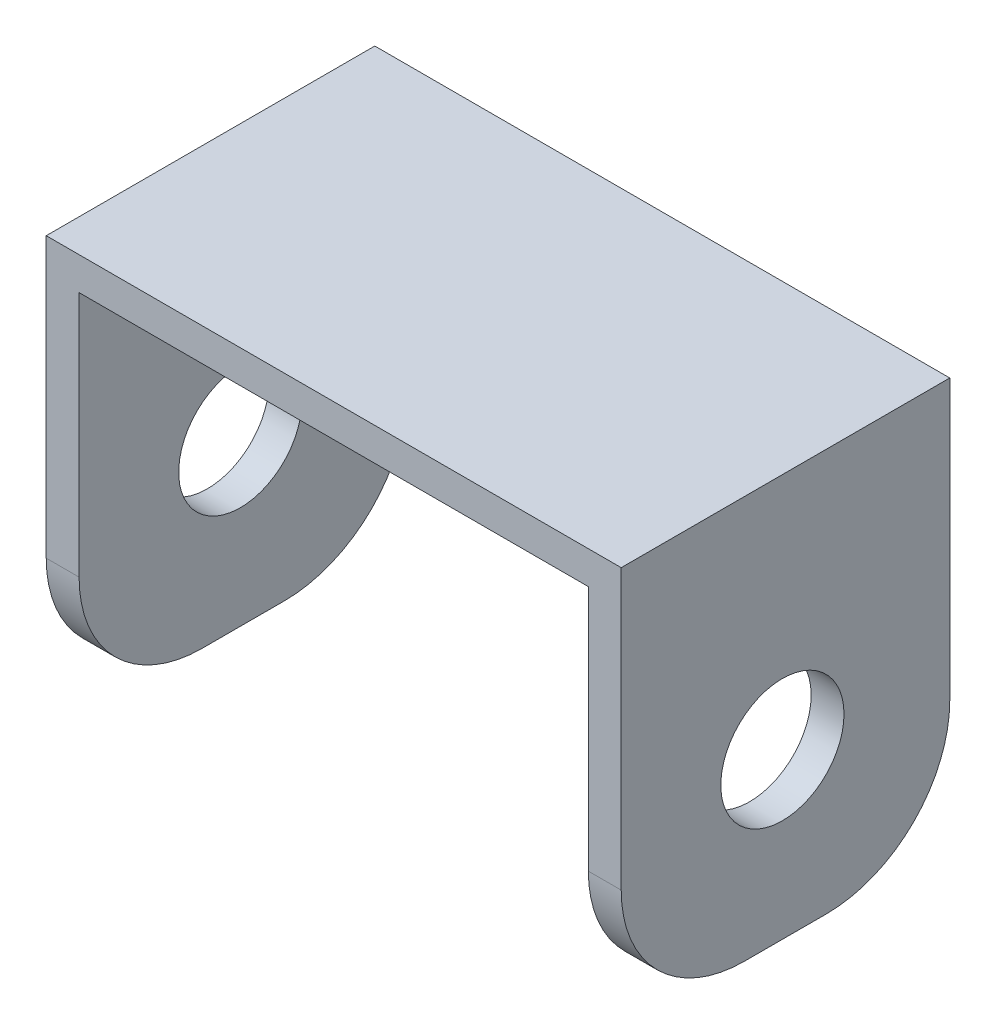
ISO-10303-21;
HEADER;
FILE_DESCRIPTION(('STEP AP214'),'2;1');
FILE_NAME('part.step','',(''),(''),'','','');
FILE_SCHEMA(('AUTOMOTIVE_DESIGN { 1 0 10303 214 1 1 1 1 }'));
ENDSEC;
DATA;
#1=APPLICATION_CONTEXT('core data for automotive mechanical design processes');
#2=APPLICATION_PROTOCOL_DEFINITION('international standard','automotive_design',2000,#1);
#3=PRODUCT_CONTEXT('',#1,'mechanical');
#4=PRODUCT('Part','Part','',(#3));
#5=PRODUCT_RELATED_PRODUCT_CATEGORY('part','',(#4));
#6=PRODUCT_DEFINITION_FORMATION('','',#4);
#7=PRODUCT_DEFINITION_CONTEXT('part definition',#1,'design');
#8=PRODUCT_DEFINITION('design','',#6,#7);
#9=PRODUCT_DEFINITION_SHAPE('','',#8);
#10=(LENGTH_UNIT() NAMED_UNIT(*) SI_UNIT(.MILLI.,.METRE.));
#11=(NAMED_UNIT(*) PLANE_ANGLE_UNIT() SI_UNIT($,.RADIAN.));
#12=(NAMED_UNIT(*) SI_UNIT($,.STERADIAN.) SOLID_ANGLE_UNIT());
#13=UNCERTAINTY_MEASURE_WITH_UNIT(LENGTH_MEASURE(1.E-05),#10,'distance_accuracy_value','');
#14=(GEOMETRIC_REPRESENTATION_CONTEXT(3) GLOBAL_UNCERTAINTY_ASSIGNED_CONTEXT((#13)) GLOBAL_UNIT_ASSIGNED_CONTEXT((#10,
#11,#12)) REPRESENTATION_CONTEXT('',''));
#15=CARTESIAN_POINT('',(0.,0.,0.));
#16=DIRECTION('',(0.,0.,1.));
#17=DIRECTION('',(1.,0.,0.));
#18=AXIS2_PLACEMENT_3D('',#15,#16,#17);
#19=CARTESIAN_POINT('',(0.,0.,0.));
#20=DIRECTION('',(0.,1.,0.));
#21=DIRECTION('',(0.,0.,1.));
#22=AXIS2_PLACEMENT_3D('',#19,#20,#21);
#23=PLANE('',#22);
#24=DIRECTION('',(0.,0.,-1.));
#25=VECTOR('',#24,1.);
#26=CARTESIAN_POINT('',(19.2495180976033,0.,9.96941465250771));
#27=LINE('',#26,#25);
#28=CARTESIAN_POINT('',(19.2495180976033,0.,9.96941465250771));
#29=VERTEX_POINT('',#28);
#30=CARTESIAN_POINT('',(19.2495180976033,0.,-10.3505853474923));
#31=VERTEX_POINT('',#30);
#32=EDGE_CURVE('E139',#29,#31,#27,.T.);
#33=ORIENTED_EDGE('',*,*,#32,.F.);
#34=DIRECTION('',(1.,0.,0.));
#35=VECTOR('',#34,1.);
#36=CARTESIAN_POINT('',(-14.2784819023967,0.,9.96941465250771));
#37=LINE('',#36,#35);
#38=CARTESIAN_POINT('',(-12.2464819023967,0.,9.96941465250771));
#39=VERTEX_POINT('',#38);
#40=EDGE_CURVE('E152',#39,#29,#37,.T.);
#41=ORIENTED_EDGE('',*,*,#40,.F.);
#42=DIRECTION('',(0.,0.,1.));
#43=VECTOR('',#42,1.);
#44=CARTESIAN_POINT('',(-12.2464819023967,0.,9.96941465250771));
#45=LINE('',#44,#43);
#46=CARTESIAN_POINT('',(-12.2464819023967,0.,-10.3505853474923));
#47=VERTEX_POINT('',#46);
#48=EDGE_CURVE('E157',#47,#39,#45,.T.);
#49=ORIENTED_EDGE('',*,*,#48,.F.);
#50=DIRECTION('',(-1.,0.,0.));
#51=VECTOR('',#50,1.);
#52=CARTESIAN_POINT('',(-14.2784819023967,0.,-10.3505853474923));
#53=LINE('',#52,#51);
#54=EDGE_CURVE('E155',#31,#47,#53,.T.);
#55=ORIENTED_EDGE('',*,*,#54,.F.);
#56=EDGE_LOOP('',(#33,#41,#49,#55));
#57=FACE_BOUND('',#56,.T.);
#58=ADVANCED_FACE('F45',(#57),#23,.F.);
#59=CARTESIAN_POINT('',(-14.2784819023967,2.032,-10.3505853474923));
#60=DIRECTION('',(1.,0.,0.));
#61=DIRECTION('',(0.,0.,-1.));
#62=AXIS2_PLACEMENT_3D('',#59,#60,#61);
#63=PLANE('',#62);
#64=CARTESIAN_POINT('',(-14.2784819023967,-12.7,0.));
#65=DIRECTION('',(1.,0.,0.));
#66=DIRECTION('',(0.,0.,-1.));
#67=AXIS2_PLACEMENT_3D('',#64,#65,#66);
#68=CIRCLE('',#67,3.81);
#69=CARTESIAN_POINT('',(-14.2784819023967,-12.7,-3.81));
#70=VERTEX_POINT('',#69);
#71=EDGE_CURVE('E147',#70,#70,#68,.T.);
#72=ORIENTED_EDGE('',*,*,#71,.T.);
#73=EDGE_LOOP('',(#72));
#74=FACE_BOUND('',#73,.T.);
#75=DIRECTION('',(0.,-1.,0.));
#76=VECTOR('',#75,1.);
#77=CARTESIAN_POINT('',(-14.2784819023967,2.032,-10.3505853474923));
#78=LINE('',#77,#76);
#79=CARTESIAN_POINT('',(-14.2784819023967,2.032,-10.3505853474923));
#80=VERTEX_POINT('',#79);
#81=CARTESIAN_POINT('',(-14.2784819023967,-15.24,-10.3505853474923));
#82=VERTEX_POINT('',#81);
#83=EDGE_CURVE('E174',#80,#82,#78,.T.);
#84=ORIENTED_EDGE('',*,*,#83,.T.);
#85=CARTESIAN_POINT('',(-14.2784819023967,-15.24,-2.73058534749229));
#86=DIRECTION('',(1.,0.,0.));
#87=DIRECTION('',(0.,0.,-1.));
#88=AXIS2_PLACEMENT_3D('',#85,#86,#87);
#89=CIRCLE('',#88,7.62);
#90=CARTESIAN_POINT('',(-14.2784819023967,-22.86,-2.73058534749229));
#91=VERTEX_POINT('',#90);
#92=EDGE_CURVE('E230',#82,#91,#89,.F.);
#93=ORIENTED_EDGE('',*,*,#92,.T.);
#94=DIRECTION('',(0.,0.,-1.));
#95=VECTOR('',#94,1.);
#96=CARTESIAN_POINT('',(-14.2784819023967,-22.86,9.96941465250771));
#97=LINE('',#96,#95);
#98=CARTESIAN_POINT('',(-14.2784819023967,-22.86,2.34941465250771));
#99=VERTEX_POINT('',#98);
#100=EDGE_CURVE('E258',#99,#91,#97,.T.);
#101=ORIENTED_EDGE('',*,*,#100,.F.);
#102=CARTESIAN_POINT('',(-14.2784819023967,-15.24,2.34941465250771));
#103=DIRECTION('',(1.,0.,0.));
#104=DIRECTION('',(0.,0.,-1.));
#105=AXIS2_PLACEMENT_3D('',#102,#103,#104);
#106=CIRCLE('',#105,7.62);
#107=CARTESIAN_POINT('',(-14.2784819023967,-15.24,9.96941465250771));
#108=VERTEX_POINT('',#107);
#109=EDGE_CURVE('E62',#99,#108,#106,.F.);
#110=ORIENTED_EDGE('',*,*,#109,.T.);
#111=DIRECTION('',(0.,-1.,0.));
#112=VECTOR('',#111,1.);
#113=CARTESIAN_POINT('',(-14.2784819023967,2.032,9.96941465250771));
#114=LINE('',#113,#112);
#115=CARTESIAN_POINT('',(-14.2784819023967,2.032,9.96941465250771));
#116=VERTEX_POINT('',#115);
#117=EDGE_CURVE('E186',#116,#108,#114,.T.);
#118=ORIENTED_EDGE('',*,*,#117,.F.);
#119=DIRECTION('',(0.,0.,1.));
#120=VECTOR('',#119,1.);
#121=CARTESIAN_POINT('',(-14.2784819023967,2.032,-10.3505853474923));
#122=LINE('',#121,#120);
#123=EDGE_CURVE('E167',#80,#116,#122,.T.);
#124=ORIENTED_EDGE('',*,*,#123,.F.);
#125=EDGE_LOOP('',(#84,#93,#101,#110,#118,#124));
#126=FACE_BOUND('',#125,.T.);
#127=ADVANCED_FACE('F287',(#74,#126),#63,.F.);
#128=CARTESIAN_POINT('',(-14.2784819023967,2.032,9.96941465250771));
#129=DIRECTION('',(0.,0.,-1.));
#130=DIRECTION('',(-1.,0.,0.));
#131=AXIS2_PLACEMENT_3D('',#128,#129,#130);
#132=PLANE('',#131);
#133=ORIENTED_EDGE('',*,*,#117,.T.);
#134=DIRECTION('',(-1.,0.,0.));
#135=VECTOR('',#134,1.);
#136=CARTESIAN_POINT('',(-12.2464819023967,-15.24,9.96941465250771));
#137=LINE('',#136,#135);
#138=CARTESIAN_POINT('',(-12.2464819023967,-15.24,9.96941465250771));
#139=VERTEX_POINT('',#138);
#140=EDGE_CURVE('E11',#108,#139,#137,.F.);
#141=ORIENTED_EDGE('',*,*,#140,.T.);
#142=DIRECTION('',(0.,1.,0.));
#143=VECTOR('',#142,1.);
#144=CARTESIAN_POINT('',(-12.2464819023967,-22.86,9.96941465250771));
#145=LINE('',#144,#143);
#146=EDGE_CURVE('E161',#139,#39,#145,.T.);
#147=ORIENTED_EDGE('',*,*,#146,.T.);
#148=ORIENTED_EDGE('',*,*,#40,.T.);
#149=DIRECTION('',(0.,1.,0.));
#150=VECTOR('',#149,1.);
#151=CARTESIAN_POINT('',(19.2495180976033,-22.86,9.96941465250771));
#152=LINE('',#151,#150);
#153=CARTESIAN_POINT('',(19.2495180976033,-15.24,9.96941465250771));
#154=VERTEX_POINT('',#153);
#155=EDGE_CURVE('E135',#154,#29,#152,.T.);
#156=ORIENTED_EDGE('',*,*,#155,.F.);
#157=DIRECTION('',(-1.,0.,0.));
#158=VECTOR('',#157,1.);
#159=CARTESIAN_POINT('',(-14.2784819023967,-15.24,9.96941465250771));
#160=LINE('',#159,#158);
#161=CARTESIAN_POINT('',(21.2815180976033,-15.24,9.96941465250771));
#162=VERTEX_POINT('',#161);
#163=EDGE_CURVE('E55',#154,#162,#160,.F.);
#164=ORIENTED_EDGE('',*,*,#163,.T.);
#165=DIRECTION('',(0.,-1.,0.));
#166=VECTOR('',#165,1.);
#167=CARTESIAN_POINT('',(21.2815180976033,2.032,9.96941465250771));
#168=LINE('',#167,#166);
#169=CARTESIAN_POINT('',(21.2815180976033,2.032,9.96941465250771));
#170=VERTEX_POINT('',#169);
#171=EDGE_CURVE('E182',#170,#162,#168,.T.);
#172=ORIENTED_EDGE('',*,*,#171,.F.);
#173=DIRECTION('',(1.,0.,0.));
#174=VECTOR('',#173,1.);
#175=CARTESIAN_POINT('',(-14.2784819023967,2.032,9.96941465250771));
#176=LINE('',#175,#174);
#177=EDGE_CURVE('E273',#116,#170,#176,.T.);
#178=ORIENTED_EDGE('',*,*,#177,.F.);
#179=EDGE_LOOP('',(#133,#141,#147,#148,#156,#164,#172,#178));
#180=FACE_BOUND('',#179,.T.);
#181=ADVANCED_FACE('F160',(#180),#132,.F.);
#182=CARTESIAN_POINT('',(21.2815180976033,2.032,-10.3505853474923));
#183=DIRECTION('',(-1.,0.,0.));
#184=DIRECTION('',(0.,0.,1.));
#185=AXIS2_PLACEMENT_3D('',#182,#183,#184);
#186=PLANE('',#185);
#187=CARTESIAN_POINT('',(21.2815180976033,-12.7,0.));
#188=DIRECTION('',(1.,0.,0.));
#189=DIRECTION('',(0.,0.,-1.));
#190=AXIS2_PLACEMENT_3D('',#187,#188,#189);
#191=CIRCLE('',#190,3.81);
#192=CARTESIAN_POINT('',(21.2815180976033,-12.7,-3.81000000000001));
#193=VERTEX_POINT('',#192);
#194=EDGE_CURVE('E417',#193,#193,#191,.T.);
#195=ORIENTED_EDGE('',*,*,#194,.F.);
#196=EDGE_LOOP('',(#195));
#197=FACE_BOUND('',#196,.T.);
#198=DIRECTION('',(0.,0.,1.));
#199=VECTOR('',#198,1.);
#200=CARTESIAN_POINT('',(21.2815180976033,-22.86,9.96941465250771));
#201=LINE('',#200,#199);
#202=CARTESIAN_POINT('',(21.2815180976033,-22.86,-2.73058534749229));
#203=VERTEX_POINT('',#202);
#204=CARTESIAN_POINT('',(21.2815180976033,-22.86,2.34941465250771));
#205=VERTEX_POINT('',#204);
#206=EDGE_CURVE('E158',#203,#205,#201,.T.);
#207=ORIENTED_EDGE('',*,*,#206,.F.);
#208=CARTESIAN_POINT('',(21.2815180976033,-15.24,-2.73058534749229));
#209=DIRECTION('',(-1.,0.,0.));
#210=DIRECTION('',(0.,0.,1.));
#211=AXIS2_PLACEMENT_3D('',#208,#209,#210);
#212=CIRCLE('',#211,7.62);
#213=CARTESIAN_POINT('',(21.2815180976033,-15.24,-10.3505853474923));
#214=VERTEX_POINT('',#213);
#215=EDGE_CURVE('E200',#203,#214,#212,.F.);
#216=ORIENTED_EDGE('',*,*,#215,.T.);
#217=DIRECTION('',(0.,-1.,0.));
#218=VECTOR('',#217,1.);
#219=CARTESIAN_POINT('',(21.2815180976033,2.032,-10.3505853474923));
#220=LINE('',#219,#218);
#221=CARTESIAN_POINT('',(21.2815180976033,2.032,-10.3505853474923));
#222=VERTEX_POINT('',#221);
#223=EDGE_CURVE('E178',#222,#214,#220,.T.);
#224=ORIENTED_EDGE('',*,*,#223,.F.);
#225=DIRECTION('',(0.,0.,-1.));
#226=VECTOR('',#225,1.);
#227=CARTESIAN_POINT('',(21.2815180976033,2.032,-10.3505853474923));
#228=LINE('',#227,#226);
#229=EDGE_CURVE('E243',#170,#222,#228,.T.);
#230=ORIENTED_EDGE('',*,*,#229,.F.);
#231=ORIENTED_EDGE('',*,*,#171,.T.);
#232=CARTESIAN_POINT('',(21.2815180976033,-15.24,2.34941465250771));
#233=DIRECTION('',(-1.,0.,0.));
#234=DIRECTION('',(0.,0.,1.));
#235=AXIS2_PLACEMENT_3D('',#232,#233,#234);
#236=CIRCLE('',#235,7.62);
#237=EDGE_CURVE('E197',#162,#205,#236,.F.);
#238=ORIENTED_EDGE('',*,*,#237,.T.);
#239=EDGE_LOOP('',(#207,#216,#224,#230,#231,#238));
#240=FACE_BOUND('',#239,.T.);
#241=ADVANCED_FACE('F240',(#197,#240),#186,.F.);
#242=CARTESIAN_POINT('',(-14.2784819023967,2.032,-10.3505853474923));
#243=DIRECTION('',(0.,0.,1.));
#244=DIRECTION('',(1.,0.,0.));
#245=AXIS2_PLACEMENT_3D('',#242,#243,#244);
#246=PLANE('',#245);
#247=ORIENTED_EDGE('',*,*,#223,.T.);
#248=DIRECTION('',(1.,0.,0.));
#249=VECTOR('',#248,1.);
#250=CARTESIAN_POINT('',(-14.2784819023967,-15.24,-10.3505853474923));
#251=LINE('',#250,#249);
#252=CARTESIAN_POINT('',(19.2495180976033,-15.24,-10.3505853474923));
#253=VERTEX_POINT('',#252);
#254=EDGE_CURVE('E206',#214,#253,#251,.F.);
#255=ORIENTED_EDGE('',*,*,#254,.T.);
#256=DIRECTION('',(0.,1.,0.));
#257=VECTOR('',#256,1.);
#258=CARTESIAN_POINT('',(19.2495180976033,-22.86,-10.3505853474923));
#259=LINE('',#258,#257);
#260=EDGE_CURVE('E146',#253,#31,#259,.T.);
#261=ORIENTED_EDGE('',*,*,#260,.T.);
#262=ORIENTED_EDGE('',*,*,#54,.T.);
#263=DIRECTION('',(0.,1.,0.));
#264=VECTOR('',#263,1.);
#265=CARTESIAN_POINT('',(-12.2464819023967,-22.86,-10.3505853474923));
#266=LINE('',#265,#264);
#267=CARTESIAN_POINT('',(-12.2464819023967,-15.24,-10.3505853474923));
#268=VERTEX_POINT('',#267);
#269=EDGE_CURVE('E163',#268,#47,#266,.T.);
#270=ORIENTED_EDGE('',*,*,#269,.F.);
#271=DIRECTION('',(1.,0.,0.));
#272=VECTOR('',#271,1.);
#273=CARTESIAN_POINT('',(-14.2784819023967,-15.24,-10.3505853474923));
#274=LINE('',#273,#272);
#275=EDGE_CURVE('E203',#268,#82,#274,.F.);
#276=ORIENTED_EDGE('',*,*,#275,.T.);
#277=ORIENTED_EDGE('',*,*,#83,.F.);
#278=DIRECTION('',(-1.,0.,0.));
#279=VECTOR('',#278,1.);
#280=CARTESIAN_POINT('',(-14.2784819023967,2.032,-10.3505853474923));
#281=LINE('',#280,#279);
#282=EDGE_CURVE('E171',#222,#80,#281,.T.);
#283=ORIENTED_EDGE('',*,*,#282,.F.);
#284=EDGE_LOOP('',(#247,#255,#261,#262,#270,#276,#277,#283));
#285=FACE_BOUND('',#284,.T.);
#286=ADVANCED_FACE('F283',(#285),#246,.F.);
#287=CARTESIAN_POINT('',(0.,2.032,0.));
#288=DIRECTION('',(0.,1.,0.));
#289=DIRECTION('',(0.,0.,1.));
#290=AXIS2_PLACEMENT_3D('',#287,#288,#289);
#291=PLANE('',#290);
#292=ORIENTED_EDGE('',*,*,#123,.T.);
#293=ORIENTED_EDGE('',*,*,#177,.T.);
#294=ORIENTED_EDGE('',*,*,#229,.T.);
#295=ORIENTED_EDGE('',*,*,#282,.T.);
#296=EDGE_LOOP('',(#292,#293,#294,#295));
#297=FACE_BOUND('',#296,.T.);
#298=ADVANCED_FACE('F280',(#297),#291,.T.);
#299=CARTESIAN_POINT('',(-12.2464819023967,-22.86,9.96941465250771));
#300=DIRECTION('',(-1.,0.,0.));
#301=DIRECTION('',(0.,0.,1.));
#302=AXIS2_PLACEMENT_3D('',#299,#300,#301);
#303=PLANE('',#302);
#304=CARTESIAN_POINT('',(-12.2464819023967,-12.7,0.));
#305=DIRECTION('',(-1.,0.,0.));
#306=DIRECTION('',(0.,0.,1.));
#307=AXIS2_PLACEMENT_3D('',#304,#305,#306);
#308=CIRCLE('',#307,3.81);
#309=CARTESIAN_POINT('',(-12.2464819023967,-12.7,-3.81));
#310=VERTEX_POINT('',#309);
#311=EDGE_CURVE('E409',#310,#310,#308,.T.);
#312=ORIENTED_EDGE('',*,*,#311,.T.);
#313=EDGE_LOOP('',(#312));
#314=FACE_BOUND('',#313,.T.);
#315=DIRECTION('',(0.,0.,1.));
#316=VECTOR('',#315,1.);
#317=CARTESIAN_POINT('',(-12.2464819023967,-22.86,9.96941465250771));
#318=LINE('',#317,#316);
#319=CARTESIAN_POINT('',(-12.2464819023967,-22.86,-2.73058534749229));
#320=VERTEX_POINT('',#319);
#321=CARTESIAN_POINT('',(-12.2464819023967,-22.86,2.34941465250771));
#322=VERTEX_POINT('',#321);
#323=EDGE_CURVE('E262',#320,#322,#318,.T.);
#324=ORIENTED_EDGE('',*,*,#323,.F.);
#325=CARTESIAN_POINT('',(-12.2464819023967,-15.24,-2.73058534749229));
#326=DIRECTION('',(-1.,0.,0.));
#327=DIRECTION('',(0.,0.,1.));
#328=AXIS2_PLACEMENT_3D('',#325,#326,#327);
#329=CIRCLE('',#328,7.62);
#330=EDGE_CURVE('E225',#320,#268,#329,.F.);
#331=ORIENTED_EDGE('',*,*,#330,.T.);
#332=ORIENTED_EDGE('',*,*,#269,.T.);
#333=ORIENTED_EDGE('',*,*,#48,.T.);
#334=ORIENTED_EDGE('',*,*,#146,.F.);
#335=CARTESIAN_POINT('',(-12.2464819023967,-15.24,2.34941465250771));
#336=DIRECTION('',(-1.,0.,0.));
#337=DIRECTION('',(0.,0.,1.));
#338=AXIS2_PLACEMENT_3D('',#335,#336,#337);
#339=CIRCLE('',#338,7.62);
#340=EDGE_CURVE('E222',#139,#322,#339,.F.);
#341=ORIENTED_EDGE('',*,*,#340,.T.);
#342=EDGE_LOOP('',(#324,#331,#332,#333,#334,#341));
#343=FACE_BOUND('',#342,.T.);
#344=ADVANCED_FACE('F294',(#314,#343),#303,.F.);
#345=CARTESIAN_POINT('',(0.,-22.86,0.));
#346=DIRECTION('',(0.,-1.,0.));
#347=DIRECTION('',(0.,0.,-1.));
#348=AXIS2_PLACEMENT_3D('',#345,#346,#347);
#349=PLANE('',#348);
#350=ORIENTED_EDGE('',*,*,#100,.T.);
#351=DIRECTION('',(1.,0.,0.));
#352=VECTOR('',#351,1.);
#353=CARTESIAN_POINT('',(-12.2464819023967,-22.86,-2.73058534749229));
#354=LINE('',#353,#352);
#355=EDGE_CURVE('E218',#91,#320,#354,.T.);
#356=ORIENTED_EDGE('',*,*,#355,.T.);
#357=ORIENTED_EDGE('',*,*,#323,.T.);
#358=DIRECTION('',(-1.,0.,0.));
#359=VECTOR('',#358,1.);
#360=CARTESIAN_POINT('',(-14.2784819023967,-22.86,2.34941465250771));
#361=LINE('',#360,#359);
#362=EDGE_CURVE('E214',#322,#99,#361,.T.);
#363=ORIENTED_EDGE('',*,*,#362,.T.);
#364=EDGE_LOOP('',(#350,#356,#357,#363));
#365=FACE_BOUND('',#364,.T.);
#366=ADVANCED_FACE('F296',(#365),#349,.T.);
#367=CARTESIAN_POINT('',(19.2495180976033,-22.86,9.96941465250771));
#368=DIRECTION('',(1.,0.,0.));
#369=DIRECTION('',(0.,0.,-1.));
#370=AXIS2_PLACEMENT_3D('',#367,#368,#369);
#371=PLANE('',#370);
#372=CARTESIAN_POINT('',(19.2495180976033,-12.7,0.));
#373=DIRECTION('',(1.,0.,0.));
#374=DIRECTION('',(0.,0.,-1.));
#375=AXIS2_PLACEMENT_3D('',#372,#373,#374);
#376=CIRCLE('',#375,3.81);
#377=CARTESIAN_POINT('',(19.2495180976033,-12.7,-3.81000000000001));
#378=VERTEX_POINT('',#377);
#379=EDGE_CURVE('E49',#378,#378,#376,.T.);
#380=ORIENTED_EDGE('',*,*,#379,.T.);
#381=EDGE_LOOP('',(#380));
#382=FACE_BOUND('',#381,.T.);
#383=ORIENTED_EDGE('',*,*,#260,.F.);
#384=CARTESIAN_POINT('',(19.2495180976033,-15.24,-2.73058534749229));
#385=DIRECTION('',(1.,0.,0.));
#386=DIRECTION('',(0.,0.,-1.));
#387=AXIS2_PLACEMENT_3D('',#384,#385,#386);
#388=CIRCLE('',#387,7.62);
#389=CARTESIAN_POINT('',(19.2495180976033,-22.86,-2.73058534749229));
#390=VERTEX_POINT('',#389);
#391=EDGE_CURVE('E211',#253,#390,#388,.F.);
#392=ORIENTED_EDGE('',*,*,#391,.T.);
#393=DIRECTION('',(0.,0.,-1.));
#394=VECTOR('',#393,1.);
#395=CARTESIAN_POINT('',(19.2495180976033,-22.86,9.96941465250771));
#396=LINE('',#395,#394);
#397=CARTESIAN_POINT('',(19.2495180976033,-22.86,2.34941465250771));
#398=VERTEX_POINT('',#397);
#399=EDGE_CURVE('E248',#398,#390,#396,.T.);
#400=ORIENTED_EDGE('',*,*,#399,.F.);
#401=CARTESIAN_POINT('',(19.2495180976033,-15.24,2.34941465250771));
#402=DIRECTION('',(1.,0.,0.));
#403=DIRECTION('',(0.,0.,-1.));
#404=AXIS2_PLACEMENT_3D('',#401,#402,#403);
#405=CIRCLE('',#404,7.62);
#406=EDGE_CURVE('E142',#398,#154,#405,.F.);
#407=ORIENTED_EDGE('',*,*,#406,.T.);
#408=ORIENTED_EDGE('',*,*,#155,.T.);
#409=ORIENTED_EDGE('',*,*,#32,.T.);
#410=EDGE_LOOP('',(#383,#392,#400,#407,#408,#409));
#411=FACE_BOUND('',#410,.T.);
#412=ADVANCED_FACE('F138',(#382,#411),#371,.F.);
#413=CARTESIAN_POINT('',(0.,-22.86,0.));
#414=DIRECTION('',(0.,1.,0.));
#415=DIRECTION('',(0.,0.,1.));
#416=AXIS2_PLACEMENT_3D('',#413,#414,#415);
#417=PLANE('',#416);
#418=ORIENTED_EDGE('',*,*,#399,.T.);
#419=DIRECTION('',(1.,0.,0.));
#420=VECTOR('',#419,1.);
#421=CARTESIAN_POINT('',(0.,-22.86,-2.73058534749229));
#422=LINE('',#421,#420);
#423=EDGE_CURVE('E193',#390,#203,#422,.T.);
#424=ORIENTED_EDGE('',*,*,#423,.T.);
#425=ORIENTED_EDGE('',*,*,#206,.T.);
#426=DIRECTION('',(-1.,0.,0.));
#427=VECTOR('',#426,1.);
#428=CARTESIAN_POINT('',(0.,-22.86,2.34941465250771));
#429=LINE('',#428,#427);
#430=EDGE_CURVE('E189',#205,#398,#429,.T.);
#431=ORIENTED_EDGE('',*,*,#430,.T.);
#432=EDGE_LOOP('',(#418,#424,#425,#431));
#433=FACE_BOUND('',#432,.T.);
#434=ADVANCED_FACE('F247',(#433),#417,.F.);
#435=CARTESIAN_POINT('',(0.,-15.24,-2.73058534749229));
#436=DIRECTION('',(1.,0.,0.));
#437=DIRECTION('',(0.,0.,-1.));
#438=AXIS2_PLACEMENT_3D('',#435,#436,#437);
#439=CYLINDRICAL_SURFACE('',#438,7.62);
#440=ORIENTED_EDGE('',*,*,#391,.F.);
#441=ORIENTED_EDGE('',*,*,#254,.F.);
#442=ORIENTED_EDGE('',*,*,#215,.F.);
#443=ORIENTED_EDGE('',*,*,#423,.F.);
#444=EDGE_LOOP('',(#440,#441,#442,#443));
#445=FACE_BOUND('',#444,.T.);
#446=ADVANCED_FACE('F302',(#445),#439,.T.);
#447=CARTESIAN_POINT('',(0.,-15.24,-2.73058534749229));
#448=DIRECTION('',(-1.,0.,0.));
#449=DIRECTION('',(0.,0.,1.));
#450=AXIS2_PLACEMENT_3D('',#447,#448,#449);
#451=CYLINDRICAL_SURFACE('',#450,7.62);
#452=ORIENTED_EDGE('',*,*,#92,.F.);
#453=ORIENTED_EDGE('',*,*,#275,.F.);
#454=ORIENTED_EDGE('',*,*,#330,.F.);
#455=ORIENTED_EDGE('',*,*,#355,.F.);
#456=EDGE_LOOP('',(#452,#453,#454,#455));
#457=FACE_BOUND('',#456,.T.);
#458=ADVANCED_FACE('F299',(#457),#451,.T.);
#459=CARTESIAN_POINT('',(0.,-15.24,2.34941465250771));
#460=DIRECTION('',(1.,0.,0.));
#461=DIRECTION('',(0.,0.,-1.));
#462=AXIS2_PLACEMENT_3D('',#459,#460,#461);
#463=CYLINDRICAL_SURFACE('',#462,7.62);
#464=ORIENTED_EDGE('',*,*,#340,.F.);
#465=ORIENTED_EDGE('',*,*,#140,.F.);
#466=ORIENTED_EDGE('',*,*,#109,.F.);
#467=ORIENTED_EDGE('',*,*,#362,.F.);
#468=EDGE_LOOP('',(#464,#465,#466,#467));
#469=FACE_BOUND('',#468,.T.);
#470=ADVANCED_FACE('F290',(#469),#463,.T.);
#471=CARTESIAN_POINT('',(0.,-15.24,2.34941465250771));
#472=DIRECTION('',(-1.,0.,0.));
#473=DIRECTION('',(0.,0.,1.));
#474=AXIS2_PLACEMENT_3D('',#471,#472,#473);
#475=CYLINDRICAL_SURFACE('',#474,7.62);
#476=ORIENTED_EDGE('',*,*,#237,.F.);
#477=ORIENTED_EDGE('',*,*,#163,.F.);
#478=ORIENTED_EDGE('',*,*,#406,.F.);
#479=ORIENTED_EDGE('',*,*,#430,.F.);
#480=EDGE_LOOP('',(#476,#477,#478,#479));
#481=FACE_BOUND('',#480,.T.);
#482=ADVANCED_FACE('F47',(#481),#475,.T.);
#483=CARTESIAN_POINT('',(-27.7404819023967,-12.7,0.));
#484=DIRECTION('',(1.,0.,0.));
#485=DIRECTION('',(0.,0.,-1.));
#486=AXIS2_PLACEMENT_3D('',#483,#484,#485);
#487=CYLINDRICAL_SURFACE('',#486,3.81);
#488=CARTESIAN_POINT('',(21.2815180976033,-12.7,-3.81000000000001));
#489=CARTESIAN_POINT('',(21.2603514309366,-12.7,-3.81000000000001));
#490=CARTESIAN_POINT('',(21.2391847642699,-12.7,-3.81000000000001));
#491=CARTESIAN_POINT('',(21.1968514309366,-12.7,-3.81000000000001));
#492=CARTESIAN_POINT('',(21.1756847642699,-12.7,-3.81000000000001));
#493=CARTESIAN_POINT('',(21.1333514309366,-12.7,-3.81000000000001));
#494=CARTESIAN_POINT('',(21.1121847642699,-12.7,-3.81000000000001));
#495=CARTESIAN_POINT('',(21.0698514309366,-12.7,-3.81000000000001));
#496=CARTESIAN_POINT('',(21.0486847642699,-12.7,-3.81000000000001));
#497=CARTESIAN_POINT('',(21.0063514309366,-12.7,-3.81000000000001));
#498=CARTESIAN_POINT('',(20.9851847642699,-12.7,-3.81000000000001));
#499=CARTESIAN_POINT('',(20.9428514309366,-12.7,-3.81000000000001));
#500=CARTESIAN_POINT('',(20.9216847642699,-12.7,-3.81000000000001));
#501=CARTESIAN_POINT('',(20.8793514309366,-12.7,-3.81000000000001));
#502=CARTESIAN_POINT('',(20.8581847642699,-12.7,-3.81000000000001));
#503=CARTESIAN_POINT('',(20.8158514309366,-12.7,-3.81000000000001));
#504=CARTESIAN_POINT('',(20.7946847642699,-12.7,-3.81000000000001));
#505=CARTESIAN_POINT('',(20.7523514309366,-12.7,-3.81000000000001));
#506=CARTESIAN_POINT('',(20.7311847642699,-12.7,-3.81000000000001));
#507=CARTESIAN_POINT('',(20.6888514309366,-12.7,-3.81000000000001));
#508=CARTESIAN_POINT('',(20.6676847642699,-12.7,-3.81000000000001));
#509=CARTESIAN_POINT('',(20.6253514309366,-12.7,-3.81000000000001));
#510=CARTESIAN_POINT('',(20.6041847642699,-12.7,-3.81000000000001));
#511=CARTESIAN_POINT('',(20.5618514309366,-12.7,-3.81000000000001));
#512=CARTESIAN_POINT('',(20.5406847642699,-12.7,-3.81000000000001));
#513=CARTESIAN_POINT('',(20.4983514309366,-12.7,-3.81000000000001));
#514=CARTESIAN_POINT('',(20.4771847642699,-12.7,-3.81000000000001));
#515=CARTESIAN_POINT('',(20.4348514309366,-12.7,-3.81000000000001));
#516=CARTESIAN_POINT('',(20.4136847642699,-12.7,-3.81000000000001));
#517=CARTESIAN_POINT('',(20.3713514309366,-12.7,-3.81000000000001));
#518=CARTESIAN_POINT('',(20.3501847642699,-12.7,-3.81000000000001));
#519=CARTESIAN_POINT('',(20.3078514309366,-12.7,-3.81000000000001));
#520=CARTESIAN_POINT('',(20.2866847642699,-12.7,-3.81000000000001));
#521=CARTESIAN_POINT('',(20.2443514309366,-12.7,-3.81000000000001));
#522=CARTESIAN_POINT('',(20.2231847642699,-12.7,-3.81000000000001));
#523=CARTESIAN_POINT('',(20.1808514309366,-12.7,-3.81000000000001));
#524=CARTESIAN_POINT('',(20.1596847642699,-12.7,-3.81000000000001));
#525=CARTESIAN_POINT('',(20.1173514309366,-12.7,-3.81000000000001));
#526=CARTESIAN_POINT('',(20.0961847642699,-12.7,-3.81000000000001));
#527=CARTESIAN_POINT('',(20.0538514309366,-12.7,-3.81000000000001));
#528=CARTESIAN_POINT('',(20.0326847642699,-12.7,-3.81000000000001));
#529=CARTESIAN_POINT('',(19.9903514309366,-12.7,-3.81000000000001));
#530=CARTESIAN_POINT('',(19.9691847642699,-12.7,-3.81000000000001));
#531=CARTESIAN_POINT('',(19.9268514309366,-12.7,-3.81000000000001));
#532=CARTESIAN_POINT('',(19.9056847642699,-12.7,-3.81000000000001));
#533=CARTESIAN_POINT('',(19.8633514309366,-12.7,-3.81000000000001));
#534=CARTESIAN_POINT('',(19.8421847642699,-12.7,-3.81000000000001));
#535=CARTESIAN_POINT('',(19.7998514309366,-12.7,-3.81000000000001));
#536=CARTESIAN_POINT('',(19.7786847642699,-12.7,-3.81000000000001));
#537=CARTESIAN_POINT('',(19.7363514309366,-12.7,-3.81000000000001));
#538=CARTESIAN_POINT('',(19.7151847642699,-12.7,-3.81000000000001));
#539=CARTESIAN_POINT('',(19.6728514309366,-12.7,-3.81000000000001));
#540=CARTESIAN_POINT('',(19.6516847642699,-12.7,-3.81000000000001));
#541=CARTESIAN_POINT('',(19.6093514309366,-12.7,-3.81000000000001));
#542=CARTESIAN_POINT('',(19.5881847642699,-12.7,-3.81000000000001));
#543=CARTESIAN_POINT('',(19.5458514309366,-12.7,-3.81000000000001));
#544=CARTESIAN_POINT('',(19.5246847642699,-12.7,-3.81000000000001));
#545=CARTESIAN_POINT('',(19.4823514309366,-12.7,-3.81000000000001));
#546=CARTESIAN_POINT('',(19.4611847642699,-12.7,-3.81000000000001));
#547=CARTESIAN_POINT('',(19.4188514309366,-12.7,-3.81000000000001));
#548=CARTESIAN_POINT('',(19.39768476427,-12.7,-3.81000000000001));
#549=CARTESIAN_POINT('',(19.3553514309366,-12.7,-3.81000000000001));
#550=CARTESIAN_POINT('',(19.3341847642699,-12.7,-3.81000000000001));
#551=CARTESIAN_POINT('',(19.2918514309366,-12.7,-3.81000000000001));
#552=CARTESIAN_POINT('',(19.2706847642699,-12.7,-3.81000000000001));
#553=CARTESIAN_POINT('',(19.2495180976033,-12.7,-3.81000000000001));
#554=B_SPLINE_CURVE_WITH_KNOTS('',3,(#488,#489,#490,#491,#492,#493,#494,#495,#496,#497,#498,
#499,#500,#501,#502,#503,#504,#505,#506,#507,#508,#509,#510,#511,#512,#513,#514,#515,#516,#517,
#518,#519,#520,#521,#522,#523,#524,#525,#526,#527,#528,#529,#530,#531,#532,#533,#534,#535,#536,
#537,#538,#539,#540,#541,#542,#543,#544,#545,#546,#547,#548,#549,#550,#551,#552,#553),
.UNSPECIFIED.,.F.,.F.,(4,2,2,2,2,2,2,2,2,2,2,2,2,2,2,2,2,2,2,2,2,2,2,2,2,2,2,2,2,2,2,2,4),(0.,
0.0635000000000011,0.127000000000002,0.190499999999996,0.253999999999997,0.317499999999998,
0.380999999999999,0.4445,0.507999999999995,0.571499999999996,0.634999999999997,
0.698499999999998,0.761999999999999,0.8255,0.888999999999994,0.952499999999995,1.016,1.0795,
1.143,1.20649999999999,1.26999999999999,1.33349999999999,1.397,1.4605,1.524,1.58749999999999,
1.65099999999999,1.71449999999999,1.77799999999999,1.8415,1.90499999999999,1.96849999999999,
2.03199999999999),.UNSPECIFIED.);
#555=EDGE_CURVE('BSEAM381',#193,#378,#554,.T.);
#556=ORIENTED_EDGE('',*,*,#194,.T.);
#557=ORIENTED_EDGE('',*,*,#379,.F.);
#558=ORIENTED_EDGE('',*,*,#555,.T.);
#559=ORIENTED_EDGE('',*,*,#555,.F.);
#560=EDGE_LOOP('',(#556,#558,#557,#559));
#561=FACE_BOUND('',#560,.T.);
#562=ADVANCED_FACE('F381',(#561),#487,.F.);
#563=CARTESIAN_POINT('',(-12.2464819023967,-12.7,-3.81));
#564=CARTESIAN_POINT('',(-12.2676485690634,-12.7,-3.81));
#565=CARTESIAN_POINT('',(-12.2888152357301,-12.7,-3.81));
#566=CARTESIAN_POINT('',(-12.3311485690634,-12.7,-3.81));
#567=CARTESIAN_POINT('',(-12.3523152357301,-12.7,-3.81));
#568=CARTESIAN_POINT('',(-12.3946485690634,-12.7,-3.81));
#569=CARTESIAN_POINT('',(-12.4158152357301,-12.7,-3.81));
#570=CARTESIAN_POINT('',(-12.4581485690634,-12.7,-3.81));
#571=CARTESIAN_POINT('',(-12.4793152357301,-12.7,-3.81));
#572=CARTESIAN_POINT('',(-12.5216485690634,-12.7,-3.81));
#573=CARTESIAN_POINT('',(-12.5428152357301,-12.7,-3.81));
#574=CARTESIAN_POINT('',(-12.5851485690634,-12.7,-3.81));
#575=CARTESIAN_POINT('',(-12.6063152357301,-12.7,-3.81));
#576=CARTESIAN_POINT('',(-12.6486485690634,-12.7,-3.81));
#577=CARTESIAN_POINT('',(-12.6698152357301,-12.7,-3.81));
#578=CARTESIAN_POINT('',(-12.7121485690634,-12.7,-3.81));
#579=CARTESIAN_POINT('',(-12.7333152357301,-12.7,-3.81));
#580=CARTESIAN_POINT('',(-12.7756485690634,-12.7,-3.81));
#581=CARTESIAN_POINT('',(-12.7968152357301,-12.7,-3.81));
#582=CARTESIAN_POINT('',(-12.8391485690634,-12.7,-3.81));
#583=CARTESIAN_POINT('',(-12.8603152357301,-12.7,-3.81));
#584=CARTESIAN_POINT('',(-12.9026485690634,-12.7,-3.81));
#585=CARTESIAN_POINT('',(-12.9238152357301,-12.7,-3.81));
#586=CARTESIAN_POINT('',(-12.9661485690634,-12.7,-3.81));
#587=CARTESIAN_POINT('',(-12.9873152357301,-12.7,-3.81));
#588=CARTESIAN_POINT('',(-13.0296485690634,-12.7,-3.81));
#589=CARTESIAN_POINT('',(-13.0508152357301,-12.7,-3.81));
#590=CARTESIAN_POINT('',(-13.0931485690634,-12.7,-3.81));
#591=CARTESIAN_POINT('',(-13.1143152357301,-12.7,-3.81));
#592=CARTESIAN_POINT('',(-13.1566485690634,-12.7,-3.81));
#593=CARTESIAN_POINT('',(-13.1778152357301,-12.7,-3.81));
#594=CARTESIAN_POINT('',(-13.2201485690634,-12.7,-3.81));
#595=CARTESIAN_POINT('',(-13.2413152357301,-12.7,-3.81));
#596=CARTESIAN_POINT('',(-13.2836485690634,-12.7,-3.81));
#597=CARTESIAN_POINT('',(-13.3048152357301,-12.7,-3.81));
#598=CARTESIAN_POINT('',(-13.3471485690634,-12.7,-3.81));
#599=CARTESIAN_POINT('',(-13.3683152357301,-12.7,-3.81));
#600=CARTESIAN_POINT('',(-13.4106485690634,-12.7,-3.81));
#601=CARTESIAN_POINT('',(-13.4318152357301,-12.7,-3.81));
#602=CARTESIAN_POINT('',(-13.4741485690634,-12.7,-3.81));
#603=CARTESIAN_POINT('',(-13.4953152357301,-12.7,-3.81));
#604=CARTESIAN_POINT('',(-13.5376485690634,-12.7,-3.81));
#605=CARTESIAN_POINT('',(-13.5588152357301,-12.7,-3.81));
#606=CARTESIAN_POINT('',(-13.6011485690634,-12.7,-3.81));
#607=CARTESIAN_POINT('',(-13.6223152357301,-12.7,-3.81));
#608=CARTESIAN_POINT('',(-13.6646485690634,-12.7,-3.81));
#609=CARTESIAN_POINT('',(-13.6858152357301,-12.7,-3.81));
#610=CARTESIAN_POINT('',(-13.7281485690634,-12.7,-3.81));
#611=CARTESIAN_POINT('',(-13.7493152357301,-12.7,-3.81));
#612=CARTESIAN_POINT('',(-13.7916485690634,-12.7,-3.81));
#613=CARTESIAN_POINT('',(-13.8128152357301,-12.7,-3.81));
#614=CARTESIAN_POINT('',(-13.8551485690634,-12.7,-3.81));
#615=CARTESIAN_POINT('',(-13.8763152357301,-12.7,-3.81));
#616=CARTESIAN_POINT('',(-13.9186485690634,-12.7,-3.81));
#617=CARTESIAN_POINT('',(-13.9398152357301,-12.7,-3.81));
#618=CARTESIAN_POINT('',(-13.9821485690634,-12.7,-3.81));
#619=CARTESIAN_POINT('',(-14.0033152357301,-12.7,-3.81));
#620=CARTESIAN_POINT('',(-14.0456485690634,-12.7,-3.81));
#621=CARTESIAN_POINT('',(-14.0668152357301,-12.7,-3.81));
#622=CARTESIAN_POINT('',(-14.1091485690634,-12.7,-3.81));
#623=CARTESIAN_POINT('',(-14.1303152357301,-12.7,-3.81));
#624=CARTESIAN_POINT('',(-14.1726485690634,-12.7,-3.81));
#625=CARTESIAN_POINT('',(-14.1938152357301,-12.7,-3.81));
#626=CARTESIAN_POINT('',(-14.2361485690634,-12.7,-3.81));
#627=CARTESIAN_POINT('',(-14.2573152357301,-12.7,-3.81));
#628=CARTESIAN_POINT('',(-14.2784819023967,-12.7,-3.81));
#629=B_SPLINE_CURVE_WITH_KNOTS('',3,(#563,#564,#565,#566,#567,#568,#569,#570,#571,#572,#573,
#574,#575,#576,#577,#578,#579,#580,#581,#582,#583,#584,#585,#586,#587,#588,#589,#590,#591,#592,
#593,#594,#595,#596,#597,#598,#599,#600,#601,#602,#603,#604,#605,#606,#607,#608,#609,#610,#611,
#612,#613,#614,#615,#616,#617,#618,#619,#620,#621,#622,#623,#624,#625,#626,#627,#628),
.UNSPECIFIED.,.F.,.F.,(4,2,2,2,2,2,2,2,2,2,2,2,2,2,2,2,2,2,2,2,2,2,2,2,2,2,2,2,2,2,2,2,4),(0.,
0.0634999999999993,0.127,0.1905,0.254000000000001,0.3175,0.380999999999999,0.4445,0.508,
0.571499999999999,0.635,0.698499999999999,0.761999999999999,0.8255,0.888999999999999,0.9525,
1.016,1.0795,1.143,1.2065,1.27,1.3335,1.397,1.4605,1.524,1.5875,1.651,1.7145,1.778,1.8415,1.905,
1.9685,2.032),.UNSPECIFIED.);
#630=EDGE_CURVE('BSEAM389',#310,#70,#629,.T.);
#631=ORIENTED_EDGE('',*,*,#311,.F.);
#632=ORIENTED_EDGE('',*,*,#71,.F.);
#633=ORIENTED_EDGE('',*,*,#630,.T.);
#634=ORIENTED_EDGE('',*,*,#630,.F.);
#635=EDGE_LOOP('',(#631,#633,#632,#634));
#636=FACE_BOUND('',#635,.T.);
#637=ADVANCED_FACE('F389',(#636),#487,.F.);
#638=CLOSED_SHELL('',(#58,#127,#181,#241,#286,#298,#344,#366,#412,#434,#446,#458,#470,#482,#562,#637));
#639=MANIFOLD_SOLID_BREP('B2',#638);
#640=ADVANCED_BREP_SHAPE_REPRESENTATION('',(#18,#639),#14);
#641=SHAPE_DEFINITION_REPRESENTATION(#9,#640);
ENDSEC;
END-ISO-10303-21;
